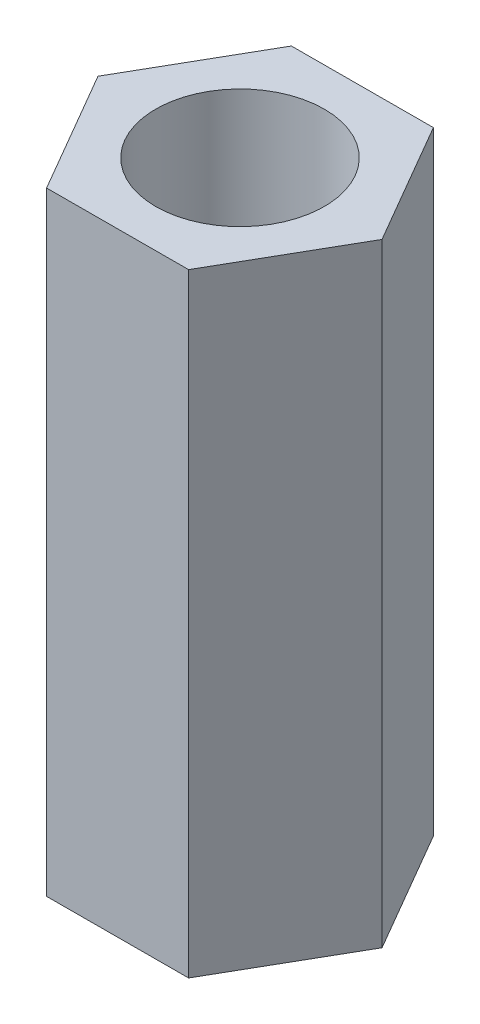
ISO-10303-21;
HEADER;
FILE_DESCRIPTION(('STEP AP214'),'2;1');
FILE_NAME('part.step','',(''),(''),'','','');
FILE_SCHEMA(('AUTOMOTIVE_DESIGN { 1 0 10303 214 1 1 1 1 }'));
ENDSEC;
DATA;
#1=APPLICATION_CONTEXT('core data for automotive mechanical design processes');
#2=APPLICATION_PROTOCOL_DEFINITION('international standard','automotive_design',2000,#1);
#3=PRODUCT_CONTEXT('',#1,'mechanical');
#4=PRODUCT('Part','Part','',(#3));
#5=PRODUCT_RELATED_PRODUCT_CATEGORY('part','',(#4));
#6=PRODUCT_DEFINITION_FORMATION('','',#4);
#7=PRODUCT_DEFINITION_CONTEXT('part definition',#1,'design');
#8=PRODUCT_DEFINITION('design','',#6,#7);
#9=PRODUCT_DEFINITION_SHAPE('','',#8);
#10=(LENGTH_UNIT() NAMED_UNIT(*) SI_UNIT(.MILLI.,.METRE.));
#11=(NAMED_UNIT(*) PLANE_ANGLE_UNIT() SI_UNIT($,.RADIAN.));
#12=(NAMED_UNIT(*) SI_UNIT($,.STERADIAN.) SOLID_ANGLE_UNIT());
#13=UNCERTAINTY_MEASURE_WITH_UNIT(LENGTH_MEASURE(1.E-05),#10,'distance_accuracy_value','');
#14=(GEOMETRIC_REPRESENTATION_CONTEXT(3) GLOBAL_UNCERTAINTY_ASSIGNED_CONTEXT((#13)) GLOBAL_UNIT_ASSIGNED_CONTEXT((#10,
#11,#12)) REPRESENTATION_CONTEXT('',''));
#15=CARTESIAN_POINT('',(0.,0.,0.));
#16=DIRECTION('',(0.,0.,1.));
#17=DIRECTION('',(1.,0.,0.));
#18=AXIS2_PLACEMENT_3D('',#15,#16,#17);
#19=CARTESIAN_POINT('',(-1.14976174095459,10.,2.00284329700813));
#20=DIRECTION('',(-0.00246764089413686,0.,-0.999996955369574));
#21=DIRECTION('',(-0.999996955369574,0.,0.00246764089413686));
#22=AXIS2_PLACEMENT_3D('',#19,#20,#21);
#23=PLANE('',#22);
#24=DIRECTION('',(0.999996955369574,0.,-0.00246764089413686));
#25=VECTOR('',#24,1.);
#26=CARTESIAN_POINT('',(-1.14976174095459,0.,2.00284329700813));
#27=LINE('',#26,#25);
#28=CARTESIAN_POINT('',(-1.14976174095459,0.,2.00284329700813));
#29=VERTEX_POINT('',#28);
#30=CARTESIAN_POINT('',(1.15963230453113,0.,1.99714452447016));
#31=VERTEX_POINT('',#30);
#32=EDGE_CURVE('E117',#29,#31,#27,.T.);
#33=ORIENTED_EDGE('',*,*,#32,.T.);
#34=DIRECTION('',(0.,-1.,0.));
#35=VECTOR('',#34,1.);
#36=CARTESIAN_POINT('',(1.15963230453113,10.,1.99714452447016));
#37=LINE('',#36,#35);
#38=CARTESIAN_POINT('',(1.15963230453113,10.,1.99714452447016));
#39=VERTEX_POINT('',#38);
#40=EDGE_CURVE('E11',#39,#31,#37,.T.);
#41=ORIENTED_EDGE('',*,*,#40,.F.);
#42=DIRECTION('',(0.999996955369574,0.,-0.00246764089413686));
#43=VECTOR('',#42,1.);
#44=CARTESIAN_POINT('',(-1.14976174095459,10.,2.00284329700813));
#45=LINE('',#44,#43);
#46=CARTESIAN_POINT('',(-1.14976174095459,10.,2.00284329700813));
#47=VERTEX_POINT('',#46);
#48=EDGE_CURVE('E128',#47,#39,#45,.T.);
#49=ORIENTED_EDGE('',*,*,#48,.F.);
#50=DIRECTION('',(0.,-1.,0.));
#51=VECTOR('',#50,1.);
#52=CARTESIAN_POINT('',(-1.14976174095459,10.,2.00284329700813));
#53=LINE('',#52,#51);
#54=EDGE_CURVE('E113',#47,#29,#53,.T.);
#55=ORIENTED_EDGE('',*,*,#54,.T.);
#56=EDGE_LOOP('',(#33,#41,#49,#55));
#57=FACE_BOUND('',#56,.T.);
#58=ADVANCED_FACE('F33',(#57),#23,.F.);
#59=CARTESIAN_POINT('',(1.15963230453113,10.,1.99714452447016));
#60=DIRECTION('',(-0.867256587504213,0.,-0.497861437983047));
#61=DIRECTION('',(-0.497861437983047,0.,0.867256587504213));
#62=AXIS2_PLACEMENT_3D('',#59,#60,#61);
#63=PLANE('',#62);
#64=DIRECTION('',(0.497861437983047,0.,-0.867256587504213));
#65=VECTOR('',#64,1.);
#66=CARTESIAN_POINT('',(1.15963230453113,0.,1.99714452447016));
#67=LINE('',#66,#65);
#68=CARTESIAN_POINT('',(2.30939404548572,0.,-0.00569877253797252));
#69=VERTEX_POINT('',#68);
#70=EDGE_CURVE('E120',#31,#69,#67,.T.);
#71=ORIENTED_EDGE('',*,*,#70,.T.);
#72=DIRECTION('',(0.,-1.,0.));
#73=VECTOR('',#72,1.);
#74=CARTESIAN_POINT('',(2.30939404548572,10.,-0.00569877253797252));
#75=LINE('',#74,#73);
#76=CARTESIAN_POINT('',(2.30939404548572,10.,-0.00569877253797252));
#77=VERTEX_POINT('',#76);
#78=EDGE_CURVE('E41',#77,#69,#75,.T.);
#79=ORIENTED_EDGE('',*,*,#78,.F.);
#80=DIRECTION('',(0.497861437983047,0.,-0.867256587504213));
#81=VECTOR('',#80,1.);
#82=CARTESIAN_POINT('',(1.15963230453113,10.,1.99714452447016));
#83=LINE('',#82,#81);
#84=EDGE_CURVE('E86',#39,#77,#83,.T.);
#85=ORIENTED_EDGE('',*,*,#84,.F.);
#86=ORIENTED_EDGE('',*,*,#40,.T.);
#87=EDGE_LOOP('',(#71,#79,#85,#86));
#88=FACE_BOUND('',#87,.T.);
#89=ADVANCED_FACE('F153',(#88),#63,.F.);
#90=CARTESIAN_POINT('',(2.30939404548572,10.,-0.00569877253797252));
#91=DIRECTION('',(-0.864788946610076,0.,0.502135517386527));
#92=DIRECTION('',(0.502135517386527,0.,0.864788946610076));
#93=AXIS2_PLACEMENT_3D('',#90,#91,#92);
#94=PLANE('',#93);
#95=DIRECTION('',(-0.502135517386527,0.,-0.864788946610076));
#96=VECTOR('',#95,1.);
#97=CARTESIAN_POINT('',(2.30939404548572,0.,-0.00569877253797252));
#98=LINE('',#97,#96);
#99=CARTESIAN_POINT('',(1.14976174095459,0.,-2.00284329700814));
#100=VERTEX_POINT('',#99);
#101=EDGE_CURVE('E123',#69,#100,#98,.T.);
#102=ORIENTED_EDGE('',*,*,#101,.T.);
#103=DIRECTION('',(0.,-1.,0.));
#104=VECTOR('',#103,1.);
#105=CARTESIAN_POINT('',(1.14976174095459,10.,-2.00284329700814));
#106=LINE('',#105,#104);
#107=CARTESIAN_POINT('',(1.14976174095459,10.,-2.00284329700814));
#108=VERTEX_POINT('',#107);
#109=EDGE_CURVE('E108',#108,#100,#106,.T.);
#110=ORIENTED_EDGE('',*,*,#109,.F.);
#111=DIRECTION('',(-0.502135517386527,0.,-0.864788946610076));
#112=VECTOR('',#111,1.);
#113=CARTESIAN_POINT('',(2.30939404548572,10.,-0.00569877253797252));
#114=LINE('',#113,#112);
#115=EDGE_CURVE('E99',#77,#108,#114,.T.);
#116=ORIENTED_EDGE('',*,*,#115,.F.);
#117=ORIENTED_EDGE('',*,*,#78,.T.);
#118=EDGE_LOOP('',(#102,#110,#116,#117));
#119=FACE_BOUND('',#118,.T.);
#120=ADVANCED_FACE('F134',(#119),#94,.F.);
#121=CARTESIAN_POINT('',(1.14976174095459,10.,-2.00284329700814));
#122=DIRECTION('',(0.00246764089413761,0.,0.999996955369574));
#123=DIRECTION('',(0.999996955369574,0.,-0.00246764089413761));
#124=AXIS2_PLACEMENT_3D('',#121,#122,#123);
#125=PLANE('',#124);
#126=DIRECTION('',(-0.999996955369574,0.,0.00246764089413761));
#127=VECTOR('',#126,1.);
#128=CARTESIAN_POINT('',(1.14976174095459,0.,-2.00284329700814));
#129=LINE('',#128,#127);
#130=CARTESIAN_POINT('',(-1.15963230453113,0.,-1.99714452447016));
#131=VERTEX_POINT('',#130);
#132=EDGE_CURVE('E107',#100,#131,#129,.T.);
#133=ORIENTED_EDGE('',*,*,#132,.T.);
#134=DIRECTION('',(0.,-1.,0.));
#135=VECTOR('',#134,1.);
#136=CARTESIAN_POINT('',(-1.15963230453113,10.,-1.99714452447016));
#137=LINE('',#136,#135);
#138=CARTESIAN_POINT('',(-1.15963230453113,10.,-1.99714452447016));
#139=VERTEX_POINT('',#138);
#140=EDGE_CURVE('E104',#139,#131,#137,.T.);
#141=ORIENTED_EDGE('',*,*,#140,.F.);
#142=DIRECTION('',(-0.999996955369574,0.,0.00246764089413761));
#143=VECTOR('',#142,1.);
#144=CARTESIAN_POINT('',(1.14976174095459,10.,-2.00284329700814));
#145=LINE('',#144,#143);
#146=EDGE_CURVE('E93',#108,#139,#145,.T.);
#147=ORIENTED_EDGE('',*,*,#146,.F.);
#148=ORIENTED_EDGE('',*,*,#109,.T.);
#149=EDGE_LOOP('',(#133,#141,#147,#148));
#150=FACE_BOUND('',#149,.T.);
#151=ADVANCED_FACE('F105',(#150),#125,.F.);
#152=CARTESIAN_POINT('',(-1.15963230453113,10.,-1.99714452447016));
#153=DIRECTION('',(0.867256587504213,0.,0.497861437983046));
#154=DIRECTION('',(0.497861437983046,0.,-0.867256587504213));
#155=AXIS2_PLACEMENT_3D('',#152,#153,#154);
#156=PLANE('',#155);
#157=DIRECTION('',(-0.497861437983046,0.,0.867256587504213));
#158=VECTOR('',#157,1.);
#159=CARTESIAN_POINT('',(-1.15963230453113,0.,-1.99714452447016));
#160=LINE('',#159,#158);
#161=CARTESIAN_POINT('',(-2.30939404548572,0.,0.00569877253797351));
#162=VERTEX_POINT('',#161);
#163=EDGE_CURVE('E72',#131,#162,#160,.T.);
#164=ORIENTED_EDGE('',*,*,#163,.T.);
#165=DIRECTION('',(0.,-1.,0.));
#166=VECTOR('',#165,1.);
#167=CARTESIAN_POINT('',(-2.30939404548572,10.,0.00569877253797351));
#168=LINE('',#167,#166);
#169=CARTESIAN_POINT('',(-2.30939404548572,10.,0.00569877253797351));
#170=VERTEX_POINT('',#169);
#171=EDGE_CURVE('E109',#170,#162,#168,.T.);
#172=ORIENTED_EDGE('',*,*,#171,.F.);
#173=DIRECTION('',(-0.497861437983046,0.,0.867256587504213));
#174=VECTOR('',#173,1.);
#175=CARTESIAN_POINT('',(-1.15963230453113,10.,-1.99714452447016));
#176=LINE('',#175,#174);
#177=EDGE_CURVE('E97',#139,#170,#176,.T.);
#178=ORIENTED_EDGE('',*,*,#177,.F.);
#179=ORIENTED_EDGE('',*,*,#140,.T.);
#180=EDGE_LOOP('',(#164,#172,#178,#179));
#181=FACE_BOUND('',#180,.T.);
#182=ADVANCED_FACE('F111',(#181),#156,.F.);
#183=CARTESIAN_POINT('',(-2.30939404548572,10.,0.00569877253797351));
#184=DIRECTION('',(0.864788946610076,0.,-0.502135517386527));
#185=DIRECTION('',(-0.502135517386527,0.,-0.864788946610076));
#186=AXIS2_PLACEMENT_3D('',#183,#184,#185);
#187=PLANE('',#186);
#188=DIRECTION('',(0.502135517386527,0.,0.864788946610076));
#189=VECTOR('',#188,1.);
#190=CARTESIAN_POINT('',(-2.30939404548572,0.,0.00569877253797351));
#191=LINE('',#190,#189);
#192=EDGE_CURVE('E78',#162,#29,#191,.T.);
#193=ORIENTED_EDGE('',*,*,#192,.T.);
#194=ORIENTED_EDGE('',*,*,#54,.F.);
#195=DIRECTION('',(0.502135517386527,0.,0.864788946610076));
#196=VECTOR('',#195,1.);
#197=CARTESIAN_POINT('',(-2.30939404548572,10.,0.00569877253797351));
#198=LINE('',#197,#196);
#199=EDGE_CURVE('E49',#170,#47,#198,.T.);
#200=ORIENTED_EDGE('',*,*,#199,.F.);
#201=ORIENTED_EDGE('',*,*,#171,.T.);
#202=EDGE_LOOP('',(#193,#194,#200,#201));
#203=FACE_BOUND('',#202,.T.);
#204=ADVANCED_FACE('F141',(#203),#187,.F.);
#205=CARTESIAN_POINT('',(0.,10.,0.));
#206=DIRECTION('',(0.,1.,0.));
#207=DIRECTION('',(0.,0.,1.));
#208=AXIS2_PLACEMENT_3D('',#205,#206,#207);
#209=PLANE('',#208);
#210=CARTESIAN_POINT('',(0.,10.,0.));
#211=DIRECTION('',(0.,1.,0.));
#212=DIRECTION('',(0.,0.,1.));
#213=AXIS2_PLACEMENT_3D('',#210,#211,#212);
#214=CIRCLE('',#213,1.375);
#215=CARTESIAN_POINT('',(0.,10.,1.375));
#216=VERTEX_POINT('',#215);
#217=EDGE_CURVE('E121',#216,#216,#214,.T.);
#218=ORIENTED_EDGE('',*,*,#217,.F.);
#219=EDGE_LOOP('',(#218));
#220=FACE_BOUND('',#219,.T.);
#221=ORIENTED_EDGE('',*,*,#48,.T.);
#222=ORIENTED_EDGE('',*,*,#84,.T.);
#223=ORIENTED_EDGE('',*,*,#115,.T.);
#224=ORIENTED_EDGE('',*,*,#146,.T.);
#225=ORIENTED_EDGE('',*,*,#177,.T.);
#226=ORIENTED_EDGE('',*,*,#199,.T.);
#227=EDGE_LOOP('',(#221,#222,#223,#224,#225,#226));
#228=FACE_BOUND('',#227,.T.);
#229=ADVANCED_FACE('F95',(#220,#228),#209,.T.);
#230=CARTESIAN_POINT('',(0.,0.,0.));
#231=DIRECTION('',(0.,1.,0.));
#232=DIRECTION('',(0.,0.,1.));
#233=AXIS2_PLACEMENT_3D('',#230,#231,#232);
#234=PLANE('',#233);
#235=CARTESIAN_POINT('',(0.,0.,0.));
#236=DIRECTION('',(0.,1.,0.));
#237=DIRECTION('',(0.,0.,1.));
#238=AXIS2_PLACEMENT_3D('',#235,#236,#237);
#239=CIRCLE('',#238,1.375);
#240=CARTESIAN_POINT('',(0.,0.,1.375));
#241=VERTEX_POINT('',#240);
#242=EDGE_CURVE('E208',#241,#241,#239,.T.);
#243=ORIENTED_EDGE('',*,*,#242,.T.);
#244=EDGE_LOOP('',(#243));
#245=FACE_BOUND('',#244,.T.);
#246=ORIENTED_EDGE('',*,*,#32,.F.);
#247=ORIENTED_EDGE('',*,*,#192,.F.);
#248=ORIENTED_EDGE('',*,*,#163,.F.);
#249=ORIENTED_EDGE('',*,*,#132,.F.);
#250=ORIENTED_EDGE('',*,*,#101,.F.);
#251=ORIENTED_EDGE('',*,*,#70,.F.);
#252=EDGE_LOOP('',(#246,#247,#248,#249,#250,#251));
#253=FACE_BOUND('',#252,.T.);
#254=ADVANCED_FACE('F137',(#245,#253),#234,.F.);
#255=CARTESIAN_POINT('',(0.,10.,0.));
#256=DIRECTION('',(0.,-1.,0.));
#257=DIRECTION('',(0.,0.,-1.));
#258=AXIS2_PLACEMENT_3D('',#255,#256,#257);
#259=CYLINDRICAL_SURFACE('',#258,1.375);
#260=ORIENTED_EDGE('',*,*,#217,.T.);
#261=EDGE_LOOP('',(#260));
#262=FACE_BOUND('',#261,.T.);
#263=ORIENTED_EDGE('',*,*,#242,.F.);
#264=EDGE_LOOP('',(#263));
#265=FACE_BOUND('',#264,.T.);
#266=ADVANCED_FACE('F190',(#262,#265),#259,.F.);
#267=CLOSED_SHELL('',(#58,#89,#120,#151,#182,#204,#229,#254,#266));
#268=MANIFOLD_SOLID_BREP('B2',#267);
#269=ADVANCED_BREP_SHAPE_REPRESENTATION('',(#18,#268),#14);
#270=SHAPE_DEFINITION_REPRESENTATION(#9,#269);
ENDSEC;
END-ISO-10303-21;
